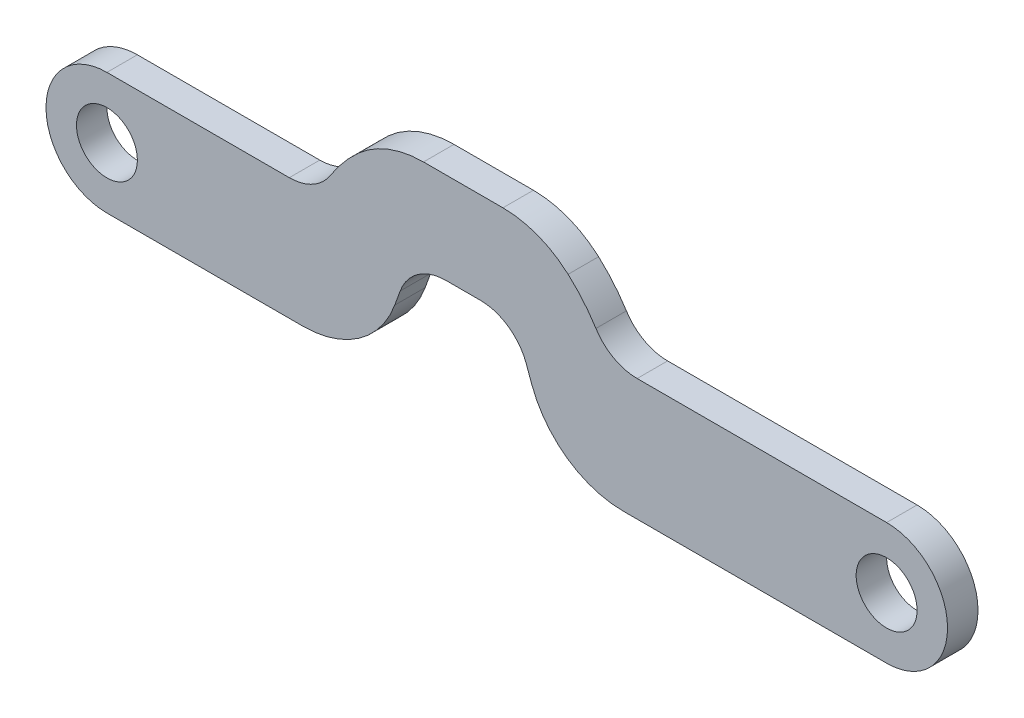
ISO-10303-21;
HEADER;
FILE_DESCRIPTION(('STEP AP214'),'2;1');
FILE_NAME('part.step','',(''),(''),'','','');
FILE_SCHEMA(('AUTOMOTIVE_DESIGN { 1 0 10303 214 1 1 1 1 }'));
ENDSEC;
DATA;
#1=APPLICATION_CONTEXT('core data for automotive mechanical design processes');
#2=APPLICATION_PROTOCOL_DEFINITION('international standard','automotive_design',2000,#1);
#3=PRODUCT_CONTEXT('',#1,'mechanical');
#4=PRODUCT('Part','Part','',(#3));
#5=PRODUCT_RELATED_PRODUCT_CATEGORY('part','',(#4));
#6=PRODUCT_DEFINITION_FORMATION('','',#4);
#7=PRODUCT_DEFINITION_CONTEXT('part definition',#1,'design');
#8=PRODUCT_DEFINITION('design','',#6,#7);
#9=PRODUCT_DEFINITION_SHAPE('','',#8);
#10=(LENGTH_UNIT() NAMED_UNIT(*) SI_UNIT(.MILLI.,.METRE.));
#11=(NAMED_UNIT(*) PLANE_ANGLE_UNIT() SI_UNIT($,.RADIAN.));
#12=(NAMED_UNIT(*) SI_UNIT($,.STERADIAN.) SOLID_ANGLE_UNIT());
#13=UNCERTAINTY_MEASURE_WITH_UNIT(LENGTH_MEASURE(1.E-05),#10,'distance_accuracy_value','');
#14=(GEOMETRIC_REPRESENTATION_CONTEXT(3) GLOBAL_UNCERTAINTY_ASSIGNED_CONTEXT((#13)) GLOBAL_UNIT_ASSIGNED_CONTEXT((#10,
#11,#12)) REPRESENTATION_CONTEXT('',''));
#15=CARTESIAN_POINT('',(0.,0.,0.));
#16=DIRECTION('',(0.,0.,1.));
#17=DIRECTION('',(1.,0.,0.));
#18=AXIS2_PLACEMENT_3D('',#15,#16,#17);
#19=CARTESIAN_POINT('',(0.,-2.,0.5));
#20=DIRECTION('',(0.,1.,0.));
#21=DIRECTION('',(-1.,0.,0.));
#22=AXIS2_PLACEMENT_3D('',#19,#20,#21);
#23=PLANE('',#22);
#24=DIRECTION('',(1.,0.,0.));
#25=VECTOR('',#24,1.);
#26=CARTESIAN_POINT('',(0.,-2.,0.5));
#27=LINE('',#26,#25);
#28=CARTESIAN_POINT('',(-8.64341319837332,-2.,0.5));
#29=VERTEX_POINT('',#28);
#30=CARTESIAN_POINT('',(0.,-2.,0.5));
#31=VERTEX_POINT('',#30);
#32=EDGE_CURVE('E178',#29,#31,#27,.T.);
#33=ORIENTED_EDGE('',*,*,#32,.F.);
#34=DIRECTION('',(0.,0.,1.));
#35=VECTOR('',#34,1.);
#36=CARTESIAN_POINT('',(-8.64341319837332,-2.,-0.5));
#37=LINE('',#36,#35);
#38=CARTESIAN_POINT('',(-8.64341319837332,-2.,-0.5));
#39=VERTEX_POINT('',#38);
#40=EDGE_CURVE('E274',#29,#39,#37,.F.);
#41=ORIENTED_EDGE('',*,*,#40,.T.);
#42=DIRECTION('',(1.,0.,0.));
#43=VECTOR('',#42,1.);
#44=CARTESIAN_POINT('',(0.,-2.,-0.5));
#45=LINE('',#44,#43);
#46=CARTESIAN_POINT('',(0.,-2.,-0.5));
#47=VERTEX_POINT('',#46);
#48=EDGE_CURVE('E203',#39,#47,#45,.T.);
#49=ORIENTED_EDGE('',*,*,#48,.T.);
#50=DIRECTION('',(0.,0.,-1.));
#51=VECTOR('',#50,1.);
#52=CARTESIAN_POINT('',(0.,-2.,0.5));
#53=LINE('',#52,#51);
#54=EDGE_CURVE('E197',#31,#47,#53,.T.);
#55=ORIENTED_EDGE('',*,*,#54,.F.);
#56=EDGE_LOOP('',(#33,#41,#49,#55));
#57=FACE_BOUND('',#56,.T.);
#58=ADVANCED_FACE('F39',(#57),#23,.F.);
#59=CARTESIAN_POINT('',(0.,0.,0.5));
#60=DIRECTION('',(0.,0.,1.));
#61=DIRECTION('',(1.,0.,0.));
#62=AXIS2_PLACEMENT_3D('',#59,#60,#61);
#63=PLANE('',#62);
#64=CARTESIAN_POINT('',(0.,0.,0.5));
#65=DIRECTION('',(0.,0.,1.));
#66=DIRECTION('',(1.,0.,0.));
#67=AXIS2_PLACEMENT_3D('',#64,#65,#66);
#68=CIRCLE('',#67,1.);
#69=CARTESIAN_POINT('',(1.,0.,0.5));
#70=VERTEX_POINT('',#69);
#71=EDGE_CURVE('E301',#70,#70,#68,.T.);
#72=ORIENTED_EDGE('',*,*,#71,.F.);
#73=EDGE_LOOP('',(#72));
#74=FACE_BOUND('',#73,.T.);
#75=CARTESIAN_POINT('',(-25.5979,0.,0.5));
#76=DIRECTION('',(0.,0.,1.));
#77=DIRECTION('',(1.,0.,0.));
#78=AXIS2_PLACEMENT_3D('',#75,#76,#77);
#79=CIRCLE('',#78,1.);
#80=CARTESIAN_POINT('',(-24.5979,0.,0.5));
#81=VERTEX_POINT('',#80);
#82=EDGE_CURVE('E298',#81,#81,#79,.T.);
#83=ORIENTED_EDGE('',*,*,#82,.F.);
#84=EDGE_LOOP('',(#83));
#85=FACE_BOUND('',#84,.T.);
#86=CARTESIAN_POINT('',(-13.9,0.,0.5));
#87=DIRECTION('',(0.,0.,1.));
#88=DIRECTION('',(1.,0.,0.));
#89=AXIS2_PLACEMENT_3D('',#86,#87,#88);
#90=CIRCLE('',#89,5.15);
#91=CARTESIAN_POINT('',(-9.543588377779,2.74666666666667,0.5));
#92=VERTEX_POINT('',#91);
#93=CARTESIAN_POINT('',(-10.4565238577648,3.82948717948718,0.5));
#94=VERTEX_POINT('',#93);
#95=EDGE_CURVE('E362',#92,#94,#90,.T.);
#96=ORIENTED_EDGE('',*,*,#95,.T.);
#97=CARTESIAN_POINT('',(-12.5961595189595,1.45,0.5));
#98=DIRECTION('',(0.,0.,1.));
#99=DIRECTION('',(1.,0.,0.));
#100=AXIS2_PLACEMENT_3D('',#97,#98,#99);
#101=CIRCLE('',#100,3.2);
#102=CARTESIAN_POINT('',(-12.5961595189595,4.65,0.5));
#103=VERTEX_POINT('',#102);
#104=EDGE_CURVE('E256',#94,#103,#101,.T.);
#105=ORIENTED_EDGE('',*,*,#104,.T.);
#106=DIRECTION('',(-1.,0.,0.));
#107=VECTOR('',#106,1.);
#108=CARTESIAN_POINT('',(0.,4.65,0.5));
#109=LINE('',#108,#107);
#110=CARTESIAN_POINT('',(-15.2038404810405,4.65,0.5));
#111=VERTEX_POINT('',#110);
#112=EDGE_CURVE('E343',#103,#111,#109,.T.);
#113=ORIENTED_EDGE('',*,*,#112,.T.);
#114=CARTESIAN_POINT('',(-15.2038404810405,1.45,0.5));
#115=DIRECTION('',(0.,0.,1.));
#116=DIRECTION('',(1.,0.,0.));
#117=AXIS2_PLACEMENT_3D('',#114,#115,#116);
#118=CIRCLE('',#117,3.2);
#119=CARTESIAN_POINT('',(-17.3434761422352,3.82948717948718,0.5));
#120=VERTEX_POINT('',#119);
#121=EDGE_CURVE('E254',#111,#120,#118,.T.);
#122=ORIENTED_EDGE('',*,*,#121,.T.);
#123=CARTESIAN_POINT('',(-18.256411622221,2.74666666666667,0.5));
#124=VERTEX_POINT('',#123);
#125=EDGE_CURVE('E363',#120,#124,#90,.T.);
#126=ORIENTED_EDGE('',*,*,#125,.T.);
#127=CARTESIAN_POINT('',(-19.6098598932023,3.6,0.5));
#128=DIRECTION('',(0.,0.,1.));
#129=DIRECTION('',(1.,0.,0.));
#130=AXIS2_PLACEMENT_3D('',#127,#128,#129);
#131=CIRCLE('',#130,1.6);
#132=CARTESIAN_POINT('',(-19.6098598932023,2.,0.5));
#133=VERTEX_POINT('',#132);
#134=EDGE_CURVE('E246',#124,#133,#131,.F.);
#135=ORIENTED_EDGE('',*,*,#134,.T.);
#136=DIRECTION('',(1.,0.,0.));
#137=VECTOR('',#136,1.);
#138=CARTESIAN_POINT('',(0.,2.,0.5));
#139=LINE('',#138,#137);
#140=CARTESIAN_POINT('',(-25.5979,2.,0.5));
#141=VERTEX_POINT('',#140);
#142=EDGE_CURVE('E294',#141,#133,#139,.T.);
#143=ORIENTED_EDGE('',*,*,#142,.F.);
#144=CARTESIAN_POINT('',(-25.5979,0.,0.5));
#145=DIRECTION('',(0.,0.,1.));
#146=DIRECTION('',(1.,0.,0.));
#147=AXIS2_PLACEMENT_3D('',#144,#145,#146);
#148=CIRCLE('',#147,2.);
#149=CARTESIAN_POINT('',(-25.5979,-2.,0.5));
#150=VERTEX_POINT('',#149);
#151=EDGE_CURVE('E288',#141,#150,#148,.T.);
#152=ORIENTED_EDGE('',*,*,#151,.T.);
#153=CARTESIAN_POINT('',(-19.1565868016267,-2.,0.5));
#154=VERTEX_POINT('',#153);
#155=EDGE_CURVE('E190',#150,#154,#27,.T.);
#156=ORIENTED_EDGE('',*,*,#155,.T.);
#157=CARTESIAN_POINT('',(-19.1565868016267,1.2,0.5));
#158=DIRECTION('',(0.,0.,1.));
#159=DIRECTION('',(1.,0.,0.));
#160=AXIS2_PLACEMENT_3D('',#157,#158,#159);
#161=CIRCLE('',#160,3.2);
#162=CARTESIAN_POINT('',(-16.1495704151118,0.105535541357843,0.5));
#163=VERTEX_POINT('',#162);
#164=EDGE_CURVE('E251',#154,#163,#161,.T.);
#165=ORIENTED_EDGE('',*,*,#164,.T.);
#166=DIRECTION('',(-0.342020143325673,-0.939692620785907,0.));
#167=VECTOR('',#166,1.);
#168=CARTESIAN_POINT('',(-14.2943480143666,5.2027171954717,0.5));
#169=LINE('',#168,#167);
#170=CARTESIAN_POINT('',(-15.9706074564059,0.597232229321073,0.5));
#171=VERTEX_POINT('',#170);
#172=EDGE_CURVE('E354',#171,#163,#169,.T.);
#173=ORIENTED_EDGE('',*,*,#172,.F.);
#174=CARTESIAN_POINT('',(-14.4670992631484,0.049999999999998,0.5));
#175=DIRECTION('',(0.,0.,1.));
#176=DIRECTION('',(1.,0.,0.));
#177=AXIS2_PLACEMENT_3D('',#174,#175,#176);
#178=CIRCLE('',#177,1.6);
#179=CARTESIAN_POINT('',(-14.4670992631484,1.65,0.5));
#180=VERTEX_POINT('',#179);
#181=EDGE_CURVE('E235',#171,#180,#178,.F.);
#182=ORIENTED_EDGE('',*,*,#181,.T.);
#183=DIRECTION('',(1.,0.,0.));
#184=VECTOR('',#183,1.);
#185=CARTESIAN_POINT('',(0.,1.65,0.5));
#186=LINE('',#185,#184);
#187=CARTESIAN_POINT('',(-13.3329007368516,1.65,0.5));
#188=VERTEX_POINT('',#187);
#189=EDGE_CURVE('E359',#180,#188,#186,.T.);
#190=ORIENTED_EDGE('',*,*,#189,.T.);
#191=CARTESIAN_POINT('',(-13.3329007368516,0.0499999999999982,0.5));
#192=DIRECTION('',(0.,0.,1.));
#193=DIRECTION('',(1.,0.,0.));
#194=AXIS2_PLACEMENT_3D('',#191,#192,#193);
#195=CIRCLE('',#194,1.6);
#196=CARTESIAN_POINT('',(-11.8293925435941,0.597232229321065,0.5));
#197=VERTEX_POINT('',#196);
#198=EDGE_CURVE('E231',#188,#197,#195,.F.);
#199=ORIENTED_EDGE('',*,*,#198,.T.);
#200=DIRECTION('',(0.342020143325666,-0.93969262078591,0.));
#201=VECTOR('',#200,1.);
#202=CARTESIAN_POINT('',(-10.2536697449872,-3.73203057917123,0.5));
#203=LINE('',#202,#201);
#204=CARTESIAN_POINT('',(-11.6504295848882,0.105535541357871,0.5));
#205=VERTEX_POINT('',#204);
#206=EDGE_CURVE('E357',#197,#205,#203,.T.);
#207=ORIENTED_EDGE('',*,*,#206,.T.);
#208=CARTESIAN_POINT('',(-8.64341319837332,1.2,0.5));
#209=DIRECTION('',(0.,0.,1.));
#210=DIRECTION('',(1.,0.,0.));
#211=AXIS2_PLACEMENT_3D('',#208,#209,#210);
#212=CIRCLE('',#211,3.2);
#213=EDGE_CURVE('E186',#205,#29,#212,.T.);
#214=ORIENTED_EDGE('',*,*,#213,.T.);
#215=ORIENTED_EDGE('',*,*,#32,.T.);
#216=CARTESIAN_POINT('',(0.,0.,0.5));
#217=DIRECTION('',(0.,0.,1.));
#218=DIRECTION('',(1.,0.,0.));
#219=AXIS2_PLACEMENT_3D('',#216,#217,#218);
#220=CIRCLE('',#219,2.);
#221=CARTESIAN_POINT('',(0.,2.,0.5));
#222=VERTEX_POINT('',#221);
#223=EDGE_CURVE('E183',#31,#222,#220,.T.);
#224=ORIENTED_EDGE('',*,*,#223,.T.);
#225=CARTESIAN_POINT('',(-8.19014010679772,2.,0.5));
#226=VERTEX_POINT('',#225);
#227=EDGE_CURVE('E200',#226,#222,#139,.T.);
#228=ORIENTED_EDGE('',*,*,#227,.F.);
#229=CARTESIAN_POINT('',(-8.19014010679772,3.6,0.5));
#230=DIRECTION('',(0.,0.,1.));
#231=DIRECTION('',(1.,0.,0.));
#232=AXIS2_PLACEMENT_3D('',#229,#230,#231);
#233=CIRCLE('',#232,1.6);
#234=EDGE_CURVE('E239',#226,#92,#233,.F.);
#235=ORIENTED_EDGE('',*,*,#234,.T.);
#236=EDGE_LOOP('',(#96,#105,#113,#122,#126,#135,#143,#152,#156,#165,#173,#182,#190,#199,#207,
#214,#215,#224,#228,#235));
#237=FACE_BOUND('',#236,.T.);
#238=ADVANCED_FACE('F181',(#74,#85,#237),#63,.T.);
#239=CARTESIAN_POINT('',(0.,0.,-0.5));
#240=DIRECTION('',(0.,0.,1.));
#241=DIRECTION('',(1.,0.,0.));
#242=AXIS2_PLACEMENT_3D('',#239,#240,#241);
#243=PLANE('',#242);
#244=CARTESIAN_POINT('',(-25.5979,0.,-0.5));
#245=DIRECTION('',(0.,0.,1.));
#246=DIRECTION('',(1.,0.,0.));
#247=AXIS2_PLACEMENT_3D('',#244,#245,#246);
#248=CIRCLE('',#247,1.);
#249=CARTESIAN_POINT('',(-24.5979,0.,-0.5));
#250=VERTEX_POINT('',#249);
#251=EDGE_CURVE('E314',#250,#250,#248,.T.);
#252=ORIENTED_EDGE('',*,*,#251,.T.);
#253=EDGE_LOOP('',(#252));
#254=FACE_BOUND('',#253,.T.);
#255=CARTESIAN_POINT('',(0.,0.,-0.5));
#256=DIRECTION('',(0.,0.,1.));
#257=DIRECTION('',(1.,0.,0.));
#258=AXIS2_PLACEMENT_3D('',#255,#256,#257);
#259=CIRCLE('',#258,1.);
#260=CARTESIAN_POINT('',(1.,0.,-0.5));
#261=VERTEX_POINT('',#260);
#262=EDGE_CURVE('E191',#261,#261,#259,.T.);
#263=ORIENTED_EDGE('',*,*,#262,.T.);
#264=EDGE_LOOP('',(#263));
#265=FACE_BOUND('',#264,.T.);
#266=DIRECTION('',(-1.,0.,0.));
#267=VECTOR('',#266,1.);
#268=CARTESIAN_POINT('',(0.,4.65,-0.5));
#269=LINE('',#268,#267);
#270=CARTESIAN_POINT('',(-12.5961595189595,4.65,-0.5));
#271=VERTEX_POINT('',#270);
#272=CARTESIAN_POINT('',(-15.2038404810405,4.65,-0.5));
#273=VERTEX_POINT('',#272);
#274=EDGE_CURVE('E335',#271,#273,#269,.T.);
#275=ORIENTED_EDGE('',*,*,#274,.F.);
#276=CARTESIAN_POINT('',(-12.5961595189595,1.45,-0.5));
#277=DIRECTION('',(0.,0.,1.));
#278=DIRECTION('',(1.,0.,0.));
#279=AXIS2_PLACEMENT_3D('',#276,#277,#278);
#280=CIRCLE('',#279,3.2);
#281=CARTESIAN_POINT('',(-10.4565238577648,3.82948717948718,-0.5));
#282=VERTEX_POINT('',#281);
#283=EDGE_CURVE('E268',#271,#282,#280,.F.);
#284=ORIENTED_EDGE('',*,*,#283,.T.);
#285=CARTESIAN_POINT('',(-13.9,0.,-0.5));
#286=DIRECTION('',(0.,0.,1.));
#287=DIRECTION('',(1.,0.,0.));
#288=AXIS2_PLACEMENT_3D('',#285,#286,#287);
#289=CIRCLE('',#288,5.15);
#290=CARTESIAN_POINT('',(-9.543588377779,2.74666666666667,-0.5));
#291=VERTEX_POINT('',#290);
#292=EDGE_CURVE('E291',#291,#282,#289,.T.);
#293=ORIENTED_EDGE('',*,*,#292,.F.);
#294=CARTESIAN_POINT('',(-8.19014010679772,3.6,-0.5));
#295=DIRECTION('',(0.,0.,1.));
#296=DIRECTION('',(1.,0.,0.));
#297=AXIS2_PLACEMENT_3D('',#294,#295,#296);
#298=CIRCLE('',#297,1.6);
#299=CARTESIAN_POINT('',(-8.19014010679772,2.,-0.5));
#300=VERTEX_POINT('',#299);
#301=EDGE_CURVE('E241',#291,#300,#298,.T.);
#302=ORIENTED_EDGE('',*,*,#301,.T.);
#303=DIRECTION('',(1.,0.,0.));
#304=VECTOR('',#303,1.);
#305=CARTESIAN_POINT('',(0.,2.,-0.5));
#306=LINE('',#305,#304);
#307=CARTESIAN_POINT('',(0.,2.,-0.5));
#308=VERTEX_POINT('',#307);
#309=EDGE_CURVE('E308',#300,#308,#306,.T.);
#310=ORIENTED_EDGE('',*,*,#309,.T.);
#311=CARTESIAN_POINT('',(0.,0.,-0.5));
#312=DIRECTION('',(0.,0.,1.));
#313=DIRECTION('',(1.,0.,0.));
#314=AXIS2_PLACEMENT_3D('',#311,#312,#313);
#315=CIRCLE('',#314,2.);
#316=EDGE_CURVE('E306',#47,#308,#315,.T.);
#317=ORIENTED_EDGE('',*,*,#316,.F.);
#318=ORIENTED_EDGE('',*,*,#48,.F.);
#319=CARTESIAN_POINT('',(-8.64341319837332,1.2,-0.5));
#320=DIRECTION('',(0.,0.,1.));
#321=DIRECTION('',(1.,0.,0.));
#322=AXIS2_PLACEMENT_3D('',#319,#320,#321);
#323=CIRCLE('',#322,3.2);
#324=CARTESIAN_POINT('',(-11.6504295848882,0.105535541357871,-0.5));
#325=VERTEX_POINT('',#324);
#326=EDGE_CURVE('E264',#39,#325,#323,.F.);
#327=ORIENTED_EDGE('',*,*,#326,.T.);
#328=DIRECTION('',(0.342020143325666,-0.93969262078591,0.));
#329=VECTOR('',#328,1.);
#330=CARTESIAN_POINT('',(-10.2536697449872,-3.73203057917123,-0.5));
#331=LINE('',#330,#329);
#332=CARTESIAN_POINT('',(-11.8293925435941,0.597232229321065,-0.5));
#333=VERTEX_POINT('',#332);
#334=EDGE_CURVE('E351',#333,#325,#331,.T.);
#335=ORIENTED_EDGE('',*,*,#334,.F.);
#336=CARTESIAN_POINT('',(-13.3329007368516,0.0499999999999982,-0.5));
#337=DIRECTION('',(0.,0.,1.));
#338=DIRECTION('',(1.,0.,0.));
#339=AXIS2_PLACEMENT_3D('',#336,#337,#338);
#340=CIRCLE('',#339,1.6);
#341=CARTESIAN_POINT('',(-13.3329007368516,1.65,-0.5));
#342=VERTEX_POINT('',#341);
#343=EDGE_CURVE('E233',#333,#342,#340,.T.);
#344=ORIENTED_EDGE('',*,*,#343,.T.);
#345=DIRECTION('',(1.,0.,0.));
#346=VECTOR('',#345,1.);
#347=CARTESIAN_POINT('',(0.,1.65,-0.5));
#348=LINE('',#347,#346);
#349=CARTESIAN_POINT('',(-14.4670992631484,1.65,-0.5));
#350=VERTEX_POINT('',#349);
#351=EDGE_CURVE('E348',#350,#342,#348,.T.);
#352=ORIENTED_EDGE('',*,*,#351,.F.);
#353=CARTESIAN_POINT('',(-14.4670992631484,0.049999999999998,-0.5));
#354=DIRECTION('',(0.,0.,1.));
#355=DIRECTION('',(1.,0.,0.));
#356=AXIS2_PLACEMENT_3D('',#353,#354,#355);
#357=CIRCLE('',#356,1.6);
#358=CARTESIAN_POINT('',(-15.9706074564059,0.597232229321073,-0.5));
#359=VERTEX_POINT('',#358);
#360=EDGE_CURVE('E237',#350,#359,#357,.T.);
#361=ORIENTED_EDGE('',*,*,#360,.T.);
#362=DIRECTION('',(-0.342020143325673,-0.939692620785907,0.));
#363=VECTOR('',#362,1.);
#364=CARTESIAN_POINT('',(-14.2943480143666,5.2027171954717,-0.5));
#365=LINE('',#364,#363);
#366=CARTESIAN_POINT('',(-16.1495704151118,0.105535541357843,-0.5));
#367=VERTEX_POINT('',#366);
#368=EDGE_CURVE('E345',#359,#367,#365,.T.);
#369=ORIENTED_EDGE('',*,*,#368,.T.);
#370=CARTESIAN_POINT('',(-19.1565868016267,1.2,-0.5));
#371=DIRECTION('',(0.,0.,1.));
#372=DIRECTION('',(1.,0.,0.));
#373=AXIS2_PLACEMENT_3D('',#370,#371,#372);
#374=CIRCLE('',#373,3.2);
#375=CARTESIAN_POINT('',(-19.1565868016267,-2.,-0.5));
#376=VERTEX_POINT('',#375);
#377=EDGE_CURVE('E62',#367,#376,#374,.F.);
#378=ORIENTED_EDGE('',*,*,#377,.T.);
#379=CARTESIAN_POINT('',(-25.5979,-2.,-0.5));
#380=VERTEX_POINT('',#379);
#381=EDGE_CURVE('E282',#380,#376,#45,.T.);
#382=ORIENTED_EDGE('',*,*,#381,.F.);
#383=CARTESIAN_POINT('',(-25.5979,0.,-0.5));
#384=DIRECTION('',(0.,0.,1.));
#385=DIRECTION('',(1.,0.,0.));
#386=AXIS2_PLACEMENT_3D('',#383,#384,#385);
#387=CIRCLE('',#386,2.);
#388=CARTESIAN_POINT('',(-25.5979,2.,-0.5));
#389=VERTEX_POINT('',#388);
#390=EDGE_CURVE('E312',#389,#380,#387,.T.);
#391=ORIENTED_EDGE('',*,*,#390,.F.);
#392=CARTESIAN_POINT('',(-19.6098598932023,2.,-0.5));
#393=VERTEX_POINT('',#392);
#394=EDGE_CURVE('E309',#389,#393,#306,.T.);
#395=ORIENTED_EDGE('',*,*,#394,.T.);
#396=CARTESIAN_POINT('',(-19.6098598932023,3.6,-0.5));
#397=DIRECTION('',(0.,0.,1.));
#398=DIRECTION('',(1.,0.,0.));
#399=AXIS2_PLACEMENT_3D('',#396,#397,#398);
#400=CIRCLE('',#399,1.6);
#401=CARTESIAN_POINT('',(-18.256411622221,2.74666666666667,-0.5));
#402=VERTEX_POINT('',#401);
#403=EDGE_CURVE('E243',#393,#402,#400,.T.);
#404=ORIENTED_EDGE('',*,*,#403,.T.);
#405=CARTESIAN_POINT('',(-17.3434761422352,3.82948717948718,-0.5));
#406=VERTEX_POINT('',#405);
#407=EDGE_CURVE('E332',#406,#402,#289,.T.);
#408=ORIENTED_EDGE('',*,*,#407,.F.);
#409=CARTESIAN_POINT('',(-15.2038404810405,1.45,-0.5));
#410=DIRECTION('',(0.,0.,1.));
#411=DIRECTION('',(1.,0.,0.));
#412=AXIS2_PLACEMENT_3D('',#409,#410,#411);
#413=CIRCLE('',#412,3.2);
#414=EDGE_CURVE('E266',#406,#273,#413,.F.);
#415=ORIENTED_EDGE('',*,*,#414,.T.);
#416=EDGE_LOOP('',(#275,#284,#293,#302,#310,#317,#318,#327,#335,#344,#352,#361,#369,#378,#382,
#391,#395,#404,#408,#415));
#417=FACE_BOUND('',#416,.T.);
#418=ADVANCED_FACE('F325',(#254,#265,#417),#243,.F.);
#419=CARTESIAN_POINT('',(-13.9,0.,0.5));
#420=DIRECTION('',(0.,0.,-1.));
#421=DIRECTION('',(-1.,0.,0.));
#422=AXIS2_PLACEMENT_3D('',#419,#420,#421);
#423=CYLINDRICAL_SURFACE('',#422,5.15);
#424=ORIENTED_EDGE('',*,*,#292,.T.);
#425=DIRECTION('',(0.,0.,-1.));
#426=VECTOR('',#425,1.);
#427=CARTESIAN_POINT('',(-10.4565238577648,3.82948717948718,0.5));
#428=LINE('',#427,#426);
#429=EDGE_CURVE('E248',#282,#94,#428,.F.);
#430=ORIENTED_EDGE('',*,*,#429,.T.);
#431=ORIENTED_EDGE('',*,*,#95,.F.);
#432=DIRECTION('',(0.,0.,-1.));
#433=VECTOR('',#432,1.);
#434=CARTESIAN_POINT('',(-9.543588377779,2.74666666666667,0.5));
#435=LINE('',#434,#433);
#436=EDGE_CURVE('E223',#92,#291,#435,.T.);
#437=ORIENTED_EDGE('',*,*,#436,.T.);
#438=EDGE_LOOP('',(#424,#430,#431,#437));
#439=FACE_BOUND('',#438,.T.);
#440=ADVANCED_FACE('F369',(#439),#423,.T.);
#441=ORIENTED_EDGE('',*,*,#125,.F.);
#442=DIRECTION('',(0.,0.,-1.));
#443=VECTOR('',#442,1.);
#444=CARTESIAN_POINT('',(-17.3434761422352,3.82948717948718,0.5));
#445=LINE('',#444,#443);
#446=EDGE_CURVE('E54',#120,#406,#445,.T.);
#447=ORIENTED_EDGE('',*,*,#446,.T.);
#448=ORIENTED_EDGE('',*,*,#407,.T.);
#449=DIRECTION('',(0.,0.,-1.));
#450=VECTOR('',#449,1.);
#451=CARTESIAN_POINT('',(-18.256411622221,2.74666666666667,0.5));
#452=LINE('',#451,#450);
#453=EDGE_CURVE('E228',#402,#124,#452,.F.);
#454=ORIENTED_EDGE('',*,*,#453,.T.);
#455=EDGE_LOOP('',(#441,#447,#448,#454));
#456=FACE_BOUND('',#455,.T.);
#457=ADVANCED_FACE('F405',(#456),#423,.T.);
#458=CARTESIAN_POINT('',(0.,2.,0.5));
#459=DIRECTION('',(0.,1.,0.));
#460=DIRECTION('',(-1.,0.,0.));
#461=AXIS2_PLACEMENT_3D('',#458,#459,#460);
#462=PLANE('',#461);
#463=ORIENTED_EDGE('',*,*,#309,.F.);
#464=DIRECTION('',(0.,0.,-1.));
#465=VECTOR('',#464,1.);
#466=CARTESIAN_POINT('',(-8.19014010679772,2.,0.5));
#467=LINE('',#466,#465);
#468=EDGE_CURVE('E220',#300,#226,#467,.F.);
#469=ORIENTED_EDGE('',*,*,#468,.T.);
#470=ORIENTED_EDGE('',*,*,#227,.T.);
#471=DIRECTION('',(0.,0.,-1.));
#472=VECTOR('',#471,1.);
#473=CARTESIAN_POINT('',(0.,2.,0.5));
#474=LINE('',#473,#472);
#475=EDGE_CURVE('E199',#222,#308,#474,.T.);
#476=ORIENTED_EDGE('',*,*,#475,.T.);
#477=EDGE_LOOP('',(#463,#469,#470,#476));
#478=FACE_BOUND('',#477,.T.);
#479=ADVANCED_FACE('F400',(#478),#462,.T.);
#480=ORIENTED_EDGE('',*,*,#142,.T.);
#481=DIRECTION('',(0.,0.,-1.));
#482=VECTOR('',#481,1.);
#483=CARTESIAN_POINT('',(-19.6098598932023,2.,0.5));
#484=LINE('',#483,#482);
#485=EDGE_CURVE('E225',#133,#393,#484,.T.);
#486=ORIENTED_EDGE('',*,*,#485,.T.);
#487=ORIENTED_EDGE('',*,*,#394,.F.);
#488=DIRECTION('',(0.,0.,-1.));
#489=VECTOR('',#488,1.);
#490=CARTESIAN_POINT('',(-25.5979,2.,0.5));
#491=LINE('',#490,#489);
#492=EDGE_CURVE('E209',#141,#389,#491,.T.);
#493=ORIENTED_EDGE('',*,*,#492,.F.);
#494=EDGE_LOOP('',(#480,#486,#487,#493));
#495=FACE_BOUND('',#494,.T.);
#496=ADVANCED_FACE('F326',(#495),#462,.T.);
#497=ORIENTED_EDGE('',*,*,#381,.T.);
#498=DIRECTION('',(0.,0.,1.));
#499=VECTOR('',#498,1.);
#500=CARTESIAN_POINT('',(-19.1565868016267,-2.,0.5));
#501=LINE('',#500,#499);
#502=EDGE_CURVE('E47',#376,#154,#501,.T.);
#503=ORIENTED_EDGE('',*,*,#502,.T.);
#504=ORIENTED_EDGE('',*,*,#155,.F.);
#505=DIRECTION('',(0.,0.,-1.));
#506=VECTOR('',#505,1.);
#507=CARTESIAN_POINT('',(-25.5979,-2.,0.5));
#508=LINE('',#507,#506);
#509=EDGE_CURVE('E304',#150,#380,#508,.T.);
#510=ORIENTED_EDGE('',*,*,#509,.T.);
#511=EDGE_LOOP('',(#497,#503,#504,#510));
#512=FACE_BOUND('',#511,.T.);
#513=ADVANCED_FACE('F280',(#512),#23,.F.);
#514=CARTESIAN_POINT('',(0.,0.,0.5));
#515=DIRECTION('',(0.,0.,-1.));
#516=DIRECTION('',(-1.,0.,0.));
#517=AXIS2_PLACEMENT_3D('',#514,#515,#516);
#518=CYLINDRICAL_SURFACE('',#517,2.);
#519=ORIENTED_EDGE('',*,*,#316,.T.);
#520=ORIENTED_EDGE('',*,*,#475,.F.);
#521=ORIENTED_EDGE('',*,*,#223,.F.);
#522=ORIENTED_EDGE('',*,*,#54,.T.);
#523=EDGE_LOOP('',(#519,#520,#521,#522));
#524=FACE_BOUND('',#523,.T.);
#525=ADVANCED_FACE('F196',(#524),#518,.T.);
#526=CARTESIAN_POINT('',(-25.5979,0.,0.5));
#527=DIRECTION('',(0.,0.,-1.));
#528=DIRECTION('',(-1.,0.,0.));
#529=AXIS2_PLACEMENT_3D('',#526,#527,#528);
#530=CYLINDRICAL_SURFACE('',#529,1.);
#531=ORIENTED_EDGE('',*,*,#82,.T.);
#532=EDGE_LOOP('',(#531));
#533=FACE_BOUND('',#532,.T.);
#534=ORIENTED_EDGE('',*,*,#251,.F.);
#535=EDGE_LOOP('',(#534));
#536=FACE_BOUND('',#535,.T.);
#537=ADVANCED_FACE('F399',(#533,#536),#530,.F.);
#538=CARTESIAN_POINT('',(-25.5979,0.,0.5));
#539=DIRECTION('',(0.,0.,-1.));
#540=DIRECTION('',(-1.,0.,0.));
#541=AXIS2_PLACEMENT_3D('',#538,#539,#540);
#542=CYLINDRICAL_SURFACE('',#541,2.);
#543=ORIENTED_EDGE('',*,*,#390,.T.);
#544=ORIENTED_EDGE('',*,*,#509,.F.);
#545=ORIENTED_EDGE('',*,*,#151,.F.);
#546=ORIENTED_EDGE('',*,*,#492,.T.);
#547=EDGE_LOOP('',(#543,#544,#545,#546));
#548=FACE_BOUND('',#547,.T.);
#549=ADVANCED_FACE('F321',(#548),#542,.T.);
#550=CARTESIAN_POINT('',(0.,0.,0.5));
#551=DIRECTION('',(0.,0.,-1.));
#552=DIRECTION('',(-1.,0.,0.));
#553=AXIS2_PLACEMENT_3D('',#550,#551,#552);
#554=CYLINDRICAL_SURFACE('',#553,1.);
#555=ORIENTED_EDGE('',*,*,#71,.T.);
#556=EDGE_LOOP('',(#555));
#557=FACE_BOUND('',#556,.T.);
#558=ORIENTED_EDGE('',*,*,#262,.F.);
#559=EDGE_LOOP('',(#558));
#560=FACE_BOUND('',#559,.T.);
#561=ADVANCED_FACE('F410',(#557,#560),#554,.F.);
#562=CARTESIAN_POINT('',(0.,4.65,-0.5));
#563=DIRECTION('',(0.,1.,0.));
#564=DIRECTION('',(0.,0.,1.));
#565=AXIS2_PLACEMENT_3D('',#562,#563,#564);
#566=PLANE('',#565);
#567=ORIENTED_EDGE('',*,*,#112,.F.);
#568=DIRECTION('',(0.,0.,1.));
#569=VECTOR('',#568,1.);
#570=CARTESIAN_POINT('',(-12.5961595189595,4.65,-0.5));
#571=LINE('',#570,#569);
#572=EDGE_CURVE('E261',#103,#271,#571,.F.);
#573=ORIENTED_EDGE('',*,*,#572,.T.);
#574=ORIENTED_EDGE('',*,*,#274,.T.);
#575=DIRECTION('',(0.,0.,1.));
#576=VECTOR('',#575,1.);
#577=CARTESIAN_POINT('',(-15.2038404810405,4.65,0.5));
#578=LINE('',#577,#576);
#579=EDGE_CURVE('E258',#273,#111,#578,.T.);
#580=ORIENTED_EDGE('',*,*,#579,.T.);
#581=EDGE_LOOP('',(#567,#573,#574,#580));
#582=FACE_BOUND('',#581,.T.);
#583=ADVANCED_FACE('F342',(#582),#566,.T.);
#584=CARTESIAN_POINT('',(-14.2943480143666,5.2027171954717,-0.5));
#585=DIRECTION('',(-0.939692620785907,0.342020143325673,0.));
#586=DIRECTION('',(-0.342020143325673,-0.939692620785907,0.));
#587=AXIS2_PLACEMENT_3D('',#584,#585,#586);
#588=PLANE('',#587);
#589=ORIENTED_EDGE('',*,*,#172,.T.);
#590=DIRECTION('',(0.,0.,1.));
#591=VECTOR('',#590,1.);
#592=CARTESIAN_POINT('',(-16.1495704151118,0.105535541357843,-0.5));
#593=LINE('',#592,#591);
#594=EDGE_CURVE('E11',#163,#367,#593,.F.);
#595=ORIENTED_EDGE('',*,*,#594,.T.);
#596=ORIENTED_EDGE('',*,*,#368,.F.);
#597=DIRECTION('',(0.,0.,1.));
#598=VECTOR('',#597,1.);
#599=CARTESIAN_POINT('',(-15.9706074564059,0.597232229321074,-0.5));
#600=LINE('',#599,#598);
#601=EDGE_CURVE('E217',#359,#171,#600,.T.);
#602=ORIENTED_EDGE('',*,*,#601,.T.);
#603=EDGE_LOOP('',(#589,#595,#596,#602));
#604=FACE_BOUND('',#603,.T.);
#605=ADVANCED_FACE('F430',(#604),#588,.F.);
#606=CARTESIAN_POINT('',(0.,1.65,-0.5));
#607=DIRECTION('',(0.,-1.,0.));
#608=DIRECTION('',(0.,0.,-1.));
#609=AXIS2_PLACEMENT_3D('',#606,#607,#608);
#610=PLANE('',#609);
#611=ORIENTED_EDGE('',*,*,#351,.T.);
#612=DIRECTION('',(0.,0.,1.));
#613=VECTOR('',#612,1.);
#614=CARTESIAN_POINT('',(-13.3329007368516,1.65,0.5));
#615=LINE('',#614,#613);
#616=EDGE_CURVE('E207',#342,#188,#615,.T.);
#617=ORIENTED_EDGE('',*,*,#616,.T.);
#618=ORIENTED_EDGE('',*,*,#189,.F.);
#619=DIRECTION('',(0.,0.,1.));
#620=VECTOR('',#619,1.);
#621=CARTESIAN_POINT('',(-14.4670992631484,1.65,-0.5));
#622=LINE('',#621,#620);
#623=EDGE_CURVE('E205',#180,#350,#622,.F.);
#624=ORIENTED_EDGE('',*,*,#623,.T.);
#625=EDGE_LOOP('',(#611,#617,#618,#624));
#626=FACE_BOUND('',#625,.T.);
#627=ADVANCED_FACE('F426',(#626),#610,.T.);
#628=CARTESIAN_POINT('',(-10.2536697449872,-3.73203057917123,-0.5));
#629=DIRECTION('',(-0.939692620785909,-0.342020143325666,0.));
#630=DIRECTION('',(0.342020143325666,-0.93969262078591,0.));
#631=AXIS2_PLACEMENT_3D('',#628,#629,#630);
#632=PLANE('',#631);
#633=ORIENTED_EDGE('',*,*,#334,.T.);
#634=DIRECTION('',(0.,0.,1.));
#635=VECTOR('',#634,1.);
#636=CARTESIAN_POINT('',(-11.6504295848882,0.10553554135787,0.5));
#637=LINE('',#636,#635);
#638=EDGE_CURVE('E271',#325,#205,#637,.T.);
#639=ORIENTED_EDGE('',*,*,#638,.T.);
#640=ORIENTED_EDGE('',*,*,#206,.F.);
#641=DIRECTION('',(0.,0.,1.));
#642=VECTOR('',#641,1.);
#643=CARTESIAN_POINT('',(-11.8293925435941,0.597232229321064,-0.5));
#644=LINE('',#643,#642);
#645=EDGE_CURVE('E215',#197,#333,#644,.F.);
#646=ORIENTED_EDGE('',*,*,#645,.T.);
#647=EDGE_LOOP('',(#633,#639,#640,#646));
#648=FACE_BOUND('',#647,.T.);
#649=ADVANCED_FACE('F422',(#648),#632,.T.);
#650=CARTESIAN_POINT('',(-13.3329007368516,0.0499999999999982,-0.5));
#651=DIRECTION('',(0.,0.,-1.));
#652=DIRECTION('',(-1.,0.,0.));
#653=AXIS2_PLACEMENT_3D('',#650,#651,#652);
#654=CYLINDRICAL_SURFACE('',#653,1.6);
#655=ORIENTED_EDGE('',*,*,#343,.F.);
#656=ORIENTED_EDGE('',*,*,#645,.F.);
#657=ORIENTED_EDGE('',*,*,#198,.F.);
#658=ORIENTED_EDGE('',*,*,#616,.F.);
#659=EDGE_LOOP('',(#655,#656,#657,#658));
#660=FACE_BOUND('',#659,.T.);
#661=ADVANCED_FACE('F425',(#660),#654,.F.);
#662=CARTESIAN_POINT('',(-14.4670992631484,0.049999999999998,-0.5));
#663=DIRECTION('',(0.,0.,1.));
#664=DIRECTION('',(1.,0.,0.));
#665=AXIS2_PLACEMENT_3D('',#662,#663,#664);
#666=CYLINDRICAL_SURFACE('',#665,1.6);
#667=ORIENTED_EDGE('',*,*,#360,.F.);
#668=ORIENTED_EDGE('',*,*,#623,.F.);
#669=ORIENTED_EDGE('',*,*,#181,.F.);
#670=ORIENTED_EDGE('',*,*,#601,.F.);
#671=EDGE_LOOP('',(#667,#668,#669,#670));
#672=FACE_BOUND('',#671,.T.);
#673=ADVANCED_FACE('F458',(#672),#666,.F.);
#674=CARTESIAN_POINT('',(-8.19014010679772,3.6,0.5));
#675=DIRECTION('',(0.,0.,-1.));
#676=DIRECTION('',(-1.,0.,0.));
#677=AXIS2_PLACEMENT_3D('',#674,#675,#676);
#678=CYLINDRICAL_SURFACE('',#677,1.6);
#679=ORIENTED_EDGE('',*,*,#301,.F.);
#680=ORIENTED_EDGE('',*,*,#436,.F.);
#681=ORIENTED_EDGE('',*,*,#234,.F.);
#682=ORIENTED_EDGE('',*,*,#468,.F.);
#683=EDGE_LOOP('',(#679,#680,#681,#682));
#684=FACE_BOUND('',#683,.T.);
#685=ADVANCED_FACE('F383',(#684),#678,.F.);
#686=CARTESIAN_POINT('',(-19.6098598932023,3.6,0.5));
#687=DIRECTION('',(0.,0.,-1.));
#688=DIRECTION('',(-1.,0.,0.));
#689=AXIS2_PLACEMENT_3D('',#686,#687,#688);
#690=CYLINDRICAL_SURFACE('',#689,1.6);
#691=ORIENTED_EDGE('',*,*,#134,.F.);
#692=ORIENTED_EDGE('',*,*,#453,.F.);
#693=ORIENTED_EDGE('',*,*,#403,.F.);
#694=ORIENTED_EDGE('',*,*,#485,.F.);
#695=EDGE_LOOP('',(#691,#692,#693,#694));
#696=FACE_BOUND('',#695,.T.);
#697=ADVANCED_FACE('F330',(#696),#690,.F.);
#698=CARTESIAN_POINT('',(-12.5961595189595,1.45,0.5));
#699=DIRECTION('',(0.,0.,-1.));
#700=DIRECTION('',(-1.,0.,0.));
#701=AXIS2_PLACEMENT_3D('',#698,#699,#700);
#702=CYLINDRICAL_SURFACE('',#701,3.2);
#703=ORIENTED_EDGE('',*,*,#283,.F.);
#704=ORIENTED_EDGE('',*,*,#572,.F.);
#705=ORIENTED_EDGE('',*,*,#104,.F.);
#706=ORIENTED_EDGE('',*,*,#429,.F.);
#707=EDGE_LOOP('',(#703,#704,#705,#706));
#708=FACE_BOUND('',#707,.T.);
#709=ADVANCED_FACE('F374',(#708),#702,.T.);
#710=CARTESIAN_POINT('',(-15.2038404810405,1.45,0.5));
#711=DIRECTION('',(0.,0.,-1.));
#712=DIRECTION('',(-1.,0.,0.));
#713=AXIS2_PLACEMENT_3D('',#710,#711,#712);
#714=CYLINDRICAL_SURFACE('',#713,3.2);
#715=ORIENTED_EDGE('',*,*,#414,.F.);
#716=ORIENTED_EDGE('',*,*,#446,.F.);
#717=ORIENTED_EDGE('',*,*,#121,.F.);
#718=ORIENTED_EDGE('',*,*,#579,.F.);
#719=EDGE_LOOP('',(#715,#716,#717,#718));
#720=FACE_BOUND('',#719,.T.);
#721=ADVANCED_FACE('F338',(#720),#714,.T.);
#722=CARTESIAN_POINT('',(-8.64341319837332,1.2,-0.5));
#723=DIRECTION('',(0.,0.,-1.));
#724=DIRECTION('',(-1.,0.,0.));
#725=AXIS2_PLACEMENT_3D('',#722,#723,#724);
#726=CYLINDRICAL_SURFACE('',#725,3.2);
#727=ORIENTED_EDGE('',*,*,#326,.F.);
#728=ORIENTED_EDGE('',*,*,#40,.F.);
#729=ORIENTED_EDGE('',*,*,#213,.F.);
#730=ORIENTED_EDGE('',*,*,#638,.F.);
#731=EDGE_LOOP('',(#727,#728,#729,#730));
#732=FACE_BOUND('',#731,.T.);
#733=ADVANCED_FACE('F381',(#732),#726,.T.);
#734=CARTESIAN_POINT('',(-19.1565868016267,1.2,0.5));
#735=DIRECTION('',(0.,0.,1.));
#736=DIRECTION('',(1.,0.,0.));
#737=AXIS2_PLACEMENT_3D('',#734,#735,#736);
#738=CYLINDRICAL_SURFACE('',#737,3.2);
#739=ORIENTED_EDGE('',*,*,#377,.F.);
#740=ORIENTED_EDGE('',*,*,#594,.F.);
#741=ORIENTED_EDGE('',*,*,#164,.F.);
#742=ORIENTED_EDGE('',*,*,#502,.F.);
#743=EDGE_LOOP('',(#739,#740,#741,#742));
#744=FACE_BOUND('',#743,.T.);
#745=ADVANCED_FACE('F41',(#744),#738,.T.);
#746=CLOSED_SHELL('',(#58,#238,#418,#440,#457,#479,#496,#513,#525,#537,#549,#561,#583,#605,#627,
#649,#661,#673,#685,#697,#709,#721,#733,#745));
#747=MANIFOLD_SOLID_BREP('B2',#746);
#748=ADVANCED_BREP_SHAPE_REPRESENTATION('',(#18,#747),#14);
#749=SHAPE_DEFINITION_REPRESENTATION(#9,#748);
ENDSEC;
END-ISO-10303-21;
